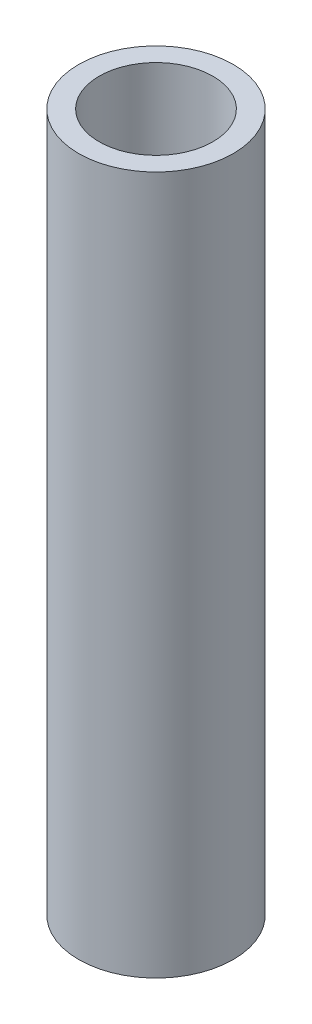
ISO-10303-21;
HEADER;
FILE_DESCRIPTION(('STEP AP214'),'2;1');
FILE_NAME('part.step','',(''),(''),'','','');
FILE_SCHEMA(('AUTOMOTIVE_DESIGN { 1 0 10303 214 1 1 1 1 }'));
ENDSEC;
DATA;
#1=APPLICATION_CONTEXT('core data for automotive mechanical design processes');
#2=APPLICATION_PROTOCOL_DEFINITION('international standard','automotive_design',2000,#1);
#3=PRODUCT_CONTEXT('',#1,'mechanical');
#4=PRODUCT('Part','Part','',(#3));
#5=PRODUCT_RELATED_PRODUCT_CATEGORY('part','',(#4));
#6=PRODUCT_DEFINITION_FORMATION('','',#4);
#7=PRODUCT_DEFINITION_CONTEXT('part definition',#1,'design');
#8=PRODUCT_DEFINITION('design','',#6,#7);
#9=PRODUCT_DEFINITION_SHAPE('','',#8);
#10=(LENGTH_UNIT() NAMED_UNIT(*) SI_UNIT(.MILLI.,.METRE.));
#11=(NAMED_UNIT(*) PLANE_ANGLE_UNIT() SI_UNIT($,.RADIAN.));
#12=(NAMED_UNIT(*) SI_UNIT($,.STERADIAN.) SOLID_ANGLE_UNIT());
#13=UNCERTAINTY_MEASURE_WITH_UNIT(LENGTH_MEASURE(1.E-05),#10,'distance_accuracy_value','');
#14=(GEOMETRIC_REPRESENTATION_CONTEXT(3) GLOBAL_UNCERTAINTY_ASSIGNED_CONTEXT((#13)) GLOBAL_UNIT_ASSIGNED_CONTEXT((#10,
#11,#12)) REPRESENTATION_CONTEXT('',''));
#15=CARTESIAN_POINT('',(0.,0.,0.));
#16=DIRECTION('',(0.,0.,1.));
#17=DIRECTION('',(1.,0.,0.));
#18=AXIS2_PLACEMENT_3D('',#15,#16,#17);
#19=CARTESIAN_POINT('',(0.,0.,0.));
#20=DIRECTION('',(0.,1.,0.));
#21=DIRECTION('',(0.,0.,1.));
#22=AXIS2_PLACEMENT_3D('',#19,#20,#21);
#23=PLANE('',#22);
#24=CARTESIAN_POINT('',(0.,0.,0.));
#25=DIRECTION('',(0.,1.,0.));
#26=DIRECTION('',(0.,0.,1.));
#27=AXIS2_PLACEMENT_3D('',#24,#25,#26);
#28=CIRCLE('',#27,5.55625);
#29=CARTESIAN_POINT('',(0.,0.,5.55625));
#30=VERTEX_POINT('',#29);
#31=EDGE_CURVE('E37',#30,#30,#28,.T.);
#32=ORIENTED_EDGE('',*,*,#31,.F.);
#33=EDGE_LOOP('',(#32));
#34=FACE_BOUND('',#33,.T.);
#35=CARTESIAN_POINT('',(0.,0.,0.));
#36=DIRECTION('',(0.,1.,0.));
#37=DIRECTION('',(0.,0.,1.));
#38=AXIS2_PLACEMENT_3D('',#35,#36,#37);
#39=CIRCLE('',#38,4.0894);
#40=CARTESIAN_POINT('',(0.,0.,4.0894));
#41=VERTEX_POINT('',#40);
#42=EDGE_CURVE('E46',#41,#41,#39,.T.);
#43=ORIENTED_EDGE('',*,*,#42,.T.);
#44=EDGE_LOOP('',(#43));
#45=FACE_BOUND('',#44,.T.);
#46=ADVANCED_FACE('F30',(#34,#45),#23,.F.);
#47=CARTESIAN_POINT('',(0.,65.915448211871,0.));
#48=DIRECTION('',(0.,-1.,0.));
#49=DIRECTION('',(0.,0.,-1.));
#50=AXIS2_PLACEMENT_3D('',#47,#48,#49);
#51=CYLINDRICAL_SURFACE('',#50,5.55625);
#52=CARTESIAN_POINT('',(0.,50.2,0.));
#53=DIRECTION('',(0.,-1.,0.));
#54=DIRECTION('',(0.,0.,-1.));
#55=AXIS2_PLACEMENT_3D('',#52,#53,#54);
#56=CIRCLE('',#55,5.55625);
#57=CARTESIAN_POINT('',(0.,50.2,-5.55625));
#58=VERTEX_POINT('',#57);
#59=EDGE_CURVE('E41',#58,#58,#56,.T.);
#60=ORIENTED_EDGE('',*,*,#59,.T.);
#61=EDGE_LOOP('',(#60));
#62=FACE_BOUND('',#61,.T.);
#63=ORIENTED_EDGE('',*,*,#31,.T.);
#64=EDGE_LOOP('',(#63));
#65=FACE_BOUND('',#64,.T.);
#66=ADVANCED_FACE('F54',(#62,#65),#51,.T.);
#67=CARTESIAN_POINT('',(0.,65.915448211871,0.));
#68=DIRECTION('',(0.,-1.,0.));
#69=DIRECTION('',(0.,0.,-1.));
#70=AXIS2_PLACEMENT_3D('',#67,#68,#69);
#71=CYLINDRICAL_SURFACE('',#70,4.0894);
#72=CARTESIAN_POINT('',(0.,50.2,0.));
#73=DIRECTION('',(0.,-1.,0.));
#74=DIRECTION('',(0.,0.,-1.));
#75=AXIS2_PLACEMENT_3D('',#72,#73,#74);
#76=CIRCLE('',#75,4.0894);
#77=CARTESIAN_POINT('',(0.,50.2,-4.0894));
#78=VERTEX_POINT('',#77);
#79=EDGE_CURVE('E10',#78,#78,#76,.T.);
#80=ORIENTED_EDGE('',*,*,#79,.F.);
#81=EDGE_LOOP('',(#80));
#82=FACE_BOUND('',#81,.T.);
#83=ORIENTED_EDGE('',*,*,#42,.F.);
#84=EDGE_LOOP('',(#83));
#85=FACE_BOUND('',#84,.T.);
#86=ADVANCED_FACE('F52',(#82,#85),#71,.F.);
#87=CARTESIAN_POINT('',(-1.14480171195881,50.2,11.0408074451236));
#88=DIRECTION('',(0.,-1.,0.));
#89=DIRECTION('',(0.103135289365661,0.,-0.99466733739852));
#90=AXIS2_PLACEMENT_3D('',#87,#88,#89);
#91=PLANE('',#90);
#92=ORIENTED_EDGE('',*,*,#79,.T.);
#93=EDGE_LOOP('',(#92));
#94=FACE_BOUND('',#93,.T.);
#95=ORIENTED_EDGE('',*,*,#59,.F.);
#96=EDGE_LOOP('',(#95));
#97=FACE_BOUND('',#96,.T.);
#98=ADVANCED_FACE('F32',(#94,#97),#91,.F.);
#99=CLOSED_SHELL('',(#46,#66,#86,#98));
#100=MANIFOLD_SOLID_BREP('B2',#99);
#101=ADVANCED_BREP_SHAPE_REPRESENTATION('',(#18,#100),#14);
#102=SHAPE_DEFINITION_REPRESENTATION(#9,#101);
ENDSEC;
END-ISO-10303-21;
